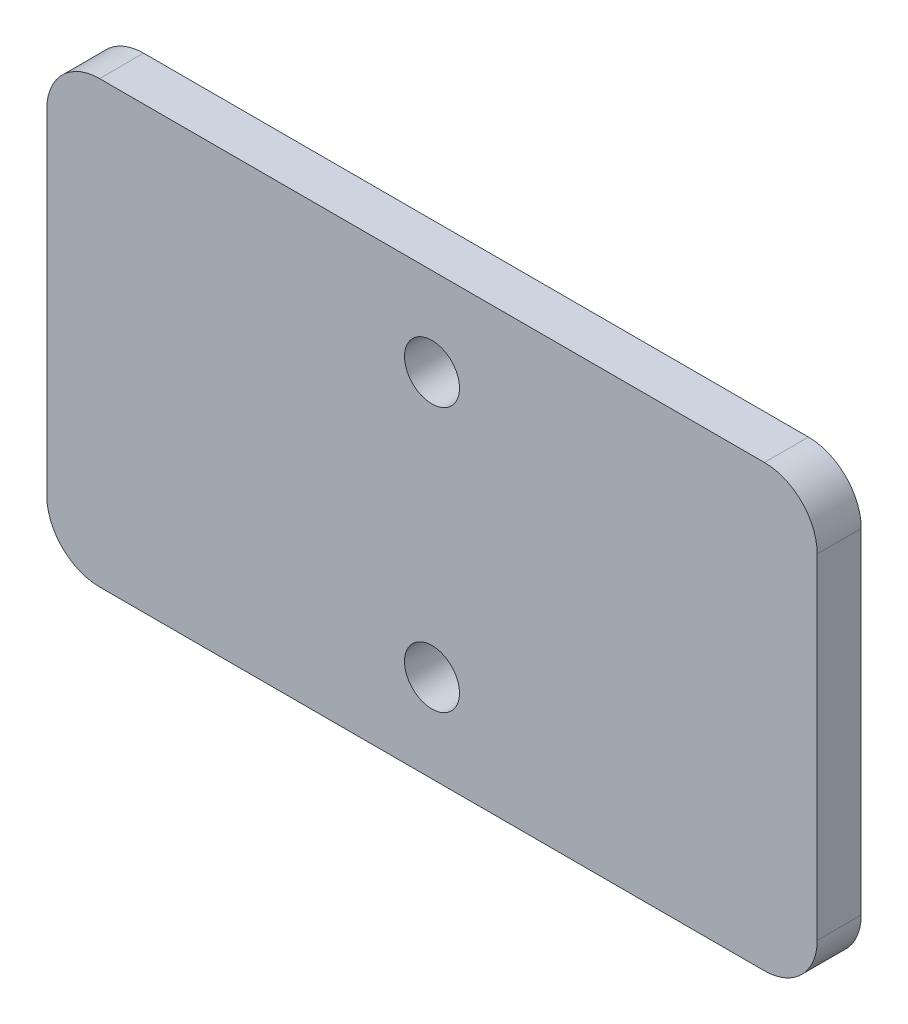
ISO-10303-21;
HEADER;
FILE_DESCRIPTION(('STEP AP214'),'2;1');
FILE_NAME('part.step','',(''),(''),'','','');
FILE_SCHEMA(('AUTOMOTIVE_DESIGN { 1 0 10303 214 1 1 1 1 }'));
ENDSEC;
DATA;
#1=APPLICATION_CONTEXT('core data for automotive mechanical design processes');
#2=APPLICATION_PROTOCOL_DEFINITION('international standard','automotive_design',2000,#1);
#3=PRODUCT_CONTEXT('',#1,'mechanical');
#4=PRODUCT('Part','Part','',(#3));
#5=PRODUCT_RELATED_PRODUCT_CATEGORY('part','',(#4));
#6=PRODUCT_DEFINITION_FORMATION('','',#4);
#7=PRODUCT_DEFINITION_CONTEXT('part definition',#1,'design');
#8=PRODUCT_DEFINITION('design','',#6,#7);
#9=PRODUCT_DEFINITION_SHAPE('','',#8);
#10=(LENGTH_UNIT() NAMED_UNIT(*) SI_UNIT(.MILLI.,.METRE.));
#11=(NAMED_UNIT(*) PLANE_ANGLE_UNIT() SI_UNIT($,.RADIAN.));
#12=(NAMED_UNIT(*) SI_UNIT($,.STERADIAN.) SOLID_ANGLE_UNIT());
#13=UNCERTAINTY_MEASURE_WITH_UNIT(LENGTH_MEASURE(1.E-05),#10,'distance_accuracy_value','');
#14=(GEOMETRIC_REPRESENTATION_CONTEXT(3) GLOBAL_UNCERTAINTY_ASSIGNED_CONTEXT((#13)) GLOBAL_UNIT_ASSIGNED_CONTEXT((#10,
#11,#12)) REPRESENTATION_CONTEXT('',''));
#15=CARTESIAN_POINT('',(0.,0.,0.));
#16=DIRECTION('',(0.,0.,1.));
#17=DIRECTION('',(1.,0.,0.));
#18=AXIS2_PLACEMENT_3D('',#15,#16,#17);
#19=CARTESIAN_POINT('',(0.,0.,10.));
#20=DIRECTION('',(0.,0.,1.));
#21=DIRECTION('',(1.,0.,0.));
#22=AXIS2_PLACEMENT_3D('',#19,#20,#21);
#23=PLANE('',#22);
#24=CARTESIAN_POINT('',(0.,30.,10.));
#25=DIRECTION('',(0.,0.,1.));
#26=DIRECTION('',(1.,0.,0.));
#27=AXIS2_PLACEMENT_3D('',#24,#25,#26);
#28=CIRCLE('',#27,6.25);
#29=CARTESIAN_POINT('',(6.25,30.,10.));
#30=VERTEX_POINT('',#29);
#31=EDGE_CURVE('E178',#30,#30,#28,.T.);
#32=ORIENTED_EDGE('',*,*,#31,.F.);
#33=EDGE_LOOP('',(#32));
#34=FACE_BOUND('',#33,.T.);
#35=DIRECTION('',(-1.,0.,0.));
#36=VECTOR('',#35,1.);
#37=CARTESIAN_POINT('',(-87.5,50.,10.));
#38=LINE('',#37,#36);
#39=CARTESIAN_POINT('',(75.5,50.,10.));
#40=VERTEX_POINT('',#39);
#41=CARTESIAN_POINT('',(-75.5,50.,10.));
#42=VERTEX_POINT('',#41);
#43=EDGE_CURVE('E169',#40,#42,#38,.T.);
#44=ORIENTED_EDGE('',*,*,#43,.T.);
#45=CARTESIAN_POINT('',(-75.5,38.,10.));
#46=DIRECTION('',(0.,0.,1.));
#47=DIRECTION('',(1.,0.,0.));
#48=AXIS2_PLACEMENT_3D('',#45,#46,#47);
#49=CIRCLE('',#48,12.);
#50=CARTESIAN_POINT('',(-87.5,38.,10.));
#51=VERTEX_POINT('',#50);
#52=EDGE_CURVE('E147',#42,#51,#49,.T.);
#53=ORIENTED_EDGE('',*,*,#52,.T.);
#54=DIRECTION('',(0.,-1.,0.));
#55=VECTOR('',#54,1.);
#56=CARTESIAN_POINT('',(-87.5,50.,10.));
#57=LINE('',#56,#55);
#58=CARTESIAN_POINT('',(-87.5,-38.,10.));
#59=VERTEX_POINT('',#58);
#60=EDGE_CURVE('E117',#51,#59,#57,.T.);
#61=ORIENTED_EDGE('',*,*,#60,.T.);
#62=CARTESIAN_POINT('',(-75.5,-38.,10.));
#63=DIRECTION('',(0.,0.,1.));
#64=DIRECTION('',(1.,0.,0.));
#65=AXIS2_PLACEMENT_3D('',#62,#63,#64);
#66=CIRCLE('',#65,12.);
#67=CARTESIAN_POINT('',(-75.5,-50.,10.));
#68=VERTEX_POINT('',#67);
#69=EDGE_CURVE('E53',#59,#68,#66,.T.);
#70=ORIENTED_EDGE('',*,*,#69,.T.);
#71=DIRECTION('',(1.,0.,0.));
#72=VECTOR('',#71,1.);
#73=CARTESIAN_POINT('',(-87.5,-50.,10.));
#74=LINE('',#73,#72);
#75=CARTESIAN_POINT('',(75.5,-50.,10.));
#76=VERTEX_POINT('',#75);
#77=EDGE_CURVE('E133',#68,#76,#74,.T.);
#78=ORIENTED_EDGE('',*,*,#77,.T.);
#79=CARTESIAN_POINT('',(75.5,-38.,10.));
#80=DIRECTION('',(0.,0.,1.));
#81=DIRECTION('',(1.,0.,0.));
#82=AXIS2_PLACEMENT_3D('',#79,#80,#81);
#83=CIRCLE('',#82,12.);
#84=CARTESIAN_POINT('',(87.5,-38.,10.));
#85=VERTEX_POINT('',#84);
#86=EDGE_CURVE('E143',#76,#85,#83,.T.);
#87=ORIENTED_EDGE('',*,*,#86,.T.);
#88=DIRECTION('',(0.,1.,0.));
#89=VECTOR('',#88,1.);
#90=CARTESIAN_POINT('',(87.5,50.,10.));
#91=LINE('',#90,#89);
#92=CARTESIAN_POINT('',(87.5,38.,10.));
#93=VERTEX_POINT('',#92);
#94=EDGE_CURVE('E127',#85,#93,#91,.T.);
#95=ORIENTED_EDGE('',*,*,#94,.T.);
#96=CARTESIAN_POINT('',(75.5,38.,10.));
#97=DIRECTION('',(0.,0.,1.));
#98=DIRECTION('',(1.,0.,0.));
#99=AXIS2_PLACEMENT_3D('',#96,#97,#98);
#100=CIRCLE('',#99,12.);
#101=EDGE_CURVE('E145',#93,#40,#100,.T.);
#102=ORIENTED_EDGE('',*,*,#101,.T.);
#103=EDGE_LOOP('',(#44,#53,#61,#70,#78,#87,#95,#102));
#104=FACE_BOUND('',#103,.T.);
#105=CARTESIAN_POINT('',(0.,-30.,10.));
#106=DIRECTION('',(0.,0.,1.));
#107=DIRECTION('',(1.,0.,0.));
#108=AXIS2_PLACEMENT_3D('',#105,#106,#107);
#109=CIRCLE('',#108,6.25);
#110=CARTESIAN_POINT('',(6.25,-30.,10.));
#111=VERTEX_POINT('',#110);
#112=EDGE_CURVE('E183',#111,#111,#109,.T.);
#113=ORIENTED_EDGE('',*,*,#112,.F.);
#114=EDGE_LOOP('',(#113));
#115=FACE_BOUND('',#114,.T.);
#116=ADVANCED_FACE('F33',(#34,#104,#115),#23,.T.);
#117=CARTESIAN_POINT('',(0.,0.,0.));
#118=DIRECTION('',(0.,0.,1.));
#119=DIRECTION('',(1.,0.,0.));
#120=AXIS2_PLACEMENT_3D('',#117,#118,#119);
#121=PLANE('',#120);
#122=DIRECTION('',(0.,-1.,0.));
#123=VECTOR('',#122,1.);
#124=CARTESIAN_POINT('',(-87.5,50.,0.));
#125=LINE('',#124,#123);
#126=CARTESIAN_POINT('',(-87.5,38.,0.));
#127=VERTEX_POINT('',#126);
#128=CARTESIAN_POINT('',(-87.5,-38.,0.));
#129=VERTEX_POINT('',#128);
#130=EDGE_CURVE('E115',#127,#129,#125,.T.);
#131=ORIENTED_EDGE('',*,*,#130,.F.);
#132=CARTESIAN_POINT('',(-75.5,38.,0.));
#133=DIRECTION('',(0.,0.,1.));
#134=DIRECTION('',(1.,0.,0.));
#135=AXIS2_PLACEMENT_3D('',#132,#133,#134);
#136=CIRCLE('',#135,12.);
#137=CARTESIAN_POINT('',(-75.5,50.,0.));
#138=VERTEX_POINT('',#137);
#139=EDGE_CURVE('E98',#127,#138,#136,.F.);
#140=ORIENTED_EDGE('',*,*,#139,.T.);
#141=DIRECTION('',(-1.,0.,0.));
#142=VECTOR('',#141,1.);
#143=CARTESIAN_POINT('',(-87.5,50.,0.));
#144=LINE('',#143,#142);
#145=CARTESIAN_POINT('',(75.5,50.,0.));
#146=VERTEX_POINT('',#145);
#147=EDGE_CURVE('E125',#146,#138,#144,.T.);
#148=ORIENTED_EDGE('',*,*,#147,.F.);
#149=CARTESIAN_POINT('',(75.5,38.,0.));
#150=DIRECTION('',(0.,0.,1.));
#151=DIRECTION('',(1.,0.,0.));
#152=AXIS2_PLACEMENT_3D('',#149,#150,#151);
#153=CIRCLE('',#152,12.);
#154=CARTESIAN_POINT('',(87.5,38.,0.));
#155=VERTEX_POINT('',#154);
#156=EDGE_CURVE('E109',#146,#155,#153,.F.);
#157=ORIENTED_EDGE('',*,*,#156,.T.);
#158=DIRECTION('',(0.,1.,0.));
#159=VECTOR('',#158,1.);
#160=CARTESIAN_POINT('',(87.5,50.,0.));
#161=LINE('',#160,#159);
#162=CARTESIAN_POINT('',(87.5,-38.,0.));
#163=VERTEX_POINT('',#162);
#164=EDGE_CURVE('E129',#163,#155,#161,.T.);
#165=ORIENTED_EDGE('',*,*,#164,.F.);
#166=CARTESIAN_POINT('',(75.5,-38.,0.));
#167=DIRECTION('',(0.,0.,1.));
#168=DIRECTION('',(1.,0.,0.));
#169=AXIS2_PLACEMENT_3D('',#166,#167,#168);
#170=CIRCLE('',#169,12.);
#171=CARTESIAN_POINT('',(75.5,-50.,0.));
#172=VERTEX_POINT('',#171);
#173=EDGE_CURVE('E136',#163,#172,#170,.F.);
#174=ORIENTED_EDGE('',*,*,#173,.T.);
#175=DIRECTION('',(1.,0.,0.));
#176=VECTOR('',#175,1.);
#177=CARTESIAN_POINT('',(-87.5,-50.,0.));
#178=LINE('',#177,#176);
#179=CARTESIAN_POINT('',(-75.5,-50.,0.));
#180=VERTEX_POINT('',#179);
#181=EDGE_CURVE('E124',#180,#172,#178,.T.);
#182=ORIENTED_EDGE('',*,*,#181,.F.);
#183=CARTESIAN_POINT('',(-75.5,-38.,0.));
#184=DIRECTION('',(0.,0.,1.));
#185=DIRECTION('',(1.,0.,0.));
#186=AXIS2_PLACEMENT_3D('',#183,#184,#185);
#187=CIRCLE('',#186,12.);
#188=EDGE_CURVE('E118',#180,#129,#187,.F.);
#189=ORIENTED_EDGE('',*,*,#188,.T.);
#190=EDGE_LOOP('',(#131,#140,#148,#157,#165,#174,#182,#189));
#191=FACE_BOUND('',#190,.T.);
#192=CARTESIAN_POINT('',(0.,30.,0.));
#193=DIRECTION('',(0.,0.,1.));
#194=DIRECTION('',(1.,0.,0.));
#195=AXIS2_PLACEMENT_3D('',#192,#193,#194);
#196=CIRCLE('',#195,6.25);
#197=CARTESIAN_POINT('',(6.25,30.,0.));
#198=VERTEX_POINT('',#197);
#199=EDGE_CURVE('E174',#198,#198,#196,.T.);
#200=ORIENTED_EDGE('',*,*,#199,.T.);
#201=EDGE_LOOP('',(#200));
#202=FACE_BOUND('',#201,.T.);
#203=CARTESIAN_POINT('',(0.,-30.,0.));
#204=DIRECTION('',(0.,0.,1.));
#205=DIRECTION('',(1.,0.,0.));
#206=AXIS2_PLACEMENT_3D('',#203,#204,#205);
#207=CIRCLE('',#206,6.25);
#208=CARTESIAN_POINT('',(6.25,-30.,0.));
#209=VERTEX_POINT('',#208);
#210=EDGE_CURVE('E185',#209,#209,#207,.T.);
#211=ORIENTED_EDGE('',*,*,#210,.T.);
#212=EDGE_LOOP('',(#211));
#213=FACE_BOUND('',#212,.T.);
#214=ADVANCED_FACE('F121',(#191,#202,#213),#121,.F.);
#215=CARTESIAN_POINT('',(87.5,50.,10.));
#216=DIRECTION('',(-1.,0.,0.));
#217=DIRECTION('',(0.,0.,1.));
#218=AXIS2_PLACEMENT_3D('',#215,#216,#217);
#219=PLANE('',#218);
#220=ORIENTED_EDGE('',*,*,#164,.T.);
#221=DIRECTION('',(0.,0.,-1.));
#222=VECTOR('',#221,1.);
#223=CARTESIAN_POINT('',(87.5,38.,10.));
#224=LINE('',#223,#222);
#225=EDGE_CURVE('E152',#155,#93,#224,.F.);
#226=ORIENTED_EDGE('',*,*,#225,.T.);
#227=ORIENTED_EDGE('',*,*,#94,.F.);
#228=DIRECTION('',(0.,0.,-1.));
#229=VECTOR('',#228,1.);
#230=CARTESIAN_POINT('',(87.5,-38.,10.));
#231=LINE('',#230,#229);
#232=EDGE_CURVE('E149',#85,#163,#231,.T.);
#233=ORIENTED_EDGE('',*,*,#232,.T.);
#234=EDGE_LOOP('',(#220,#226,#227,#233));
#235=FACE_BOUND('',#234,.T.);
#236=ADVANCED_FACE('F165',(#235),#219,.F.);
#237=CARTESIAN_POINT('',(-87.5,50.,10.));
#238=DIRECTION('',(0.,-1.,0.));
#239=DIRECTION('',(0.,0.,-1.));
#240=AXIS2_PLACEMENT_3D('',#237,#238,#239);
#241=PLANE('',#240);
#242=ORIENTED_EDGE('',*,*,#147,.T.);
#243=DIRECTION('',(0.,0.,-1.));
#244=VECTOR('',#243,1.);
#245=CARTESIAN_POINT('',(-75.5,50.,10.));
#246=LINE('',#245,#244);
#247=EDGE_CURVE('E103',#138,#42,#246,.F.);
#248=ORIENTED_EDGE('',*,*,#247,.T.);
#249=ORIENTED_EDGE('',*,*,#43,.F.);
#250=DIRECTION('',(0.,0.,-1.));
#251=VECTOR('',#250,1.);
#252=CARTESIAN_POINT('',(75.5,50.,10.));
#253=LINE('',#252,#251);
#254=EDGE_CURVE('E108',#40,#146,#253,.T.);
#255=ORIENTED_EDGE('',*,*,#254,.T.);
#256=EDGE_LOOP('',(#242,#248,#249,#255));
#257=FACE_BOUND('',#256,.T.);
#258=ADVANCED_FACE('F209',(#257),#241,.F.);
#259=CARTESIAN_POINT('',(-87.5,50.,10.));
#260=DIRECTION('',(1.,0.,0.));
#261=DIRECTION('',(0.,0.,-1.));
#262=AXIS2_PLACEMENT_3D('',#259,#260,#261);
#263=PLANE('',#262);
#264=ORIENTED_EDGE('',*,*,#60,.F.);
#265=DIRECTION('',(0.,0.,-1.));
#266=VECTOR('',#265,1.);
#267=CARTESIAN_POINT('',(-87.5,38.,10.));
#268=LINE('',#267,#266);
#269=EDGE_CURVE('E102',#51,#127,#268,.T.);
#270=ORIENTED_EDGE('',*,*,#269,.T.);
#271=ORIENTED_EDGE('',*,*,#130,.T.);
#272=DIRECTION('',(0.,0.,-1.));
#273=VECTOR('',#272,1.);
#274=CARTESIAN_POINT('',(-87.5,-38.,10.));
#275=LINE('',#274,#273);
#276=EDGE_CURVE('E119',#129,#59,#275,.F.);
#277=ORIENTED_EDGE('',*,*,#276,.T.);
#278=EDGE_LOOP('',(#264,#270,#271,#277));
#279=FACE_BOUND('',#278,.T.);
#280=ADVANCED_FACE('F114',(#279),#263,.F.);
#281=CARTESIAN_POINT('',(-87.5,-50.,10.));
#282=DIRECTION('',(0.,1.,0.));
#283=DIRECTION('',(0.,0.,1.));
#284=AXIS2_PLACEMENT_3D('',#281,#282,#283);
#285=PLANE('',#284);
#286=ORIENTED_EDGE('',*,*,#181,.T.);
#287=DIRECTION('',(0.,0.,-1.));
#288=VECTOR('',#287,1.);
#289=CARTESIAN_POINT('',(75.5,-50.,10.));
#290=LINE('',#289,#288);
#291=EDGE_CURVE('E11',#172,#76,#290,.F.);
#292=ORIENTED_EDGE('',*,*,#291,.T.);
#293=ORIENTED_EDGE('',*,*,#77,.F.);
#294=DIRECTION('',(0.,0.,-1.));
#295=VECTOR('',#294,1.);
#296=CARTESIAN_POINT('',(-75.5,-50.,10.));
#297=LINE('',#296,#295);
#298=EDGE_CURVE('E41',#68,#180,#297,.T.);
#299=ORIENTED_EDGE('',*,*,#298,.T.);
#300=EDGE_LOOP('',(#286,#292,#293,#299));
#301=FACE_BOUND('',#300,.T.);
#302=ADVANCED_FACE('F155',(#301),#285,.F.);
#303=CARTESIAN_POINT('',(0.,30.,10.));
#304=DIRECTION('',(0.,0.,-1.));
#305=DIRECTION('',(-1.,0.,0.));
#306=AXIS2_PLACEMENT_3D('',#303,#304,#305);
#307=CYLINDRICAL_SURFACE('',#306,6.25);
#308=ORIENTED_EDGE('',*,*,#31,.T.);
#309=EDGE_LOOP('',(#308));
#310=FACE_BOUND('',#309,.T.);
#311=ORIENTED_EDGE('',*,*,#199,.F.);
#312=EDGE_LOOP('',(#311));
#313=FACE_BOUND('',#312,.T.);
#314=ADVANCED_FACE('F202',(#310,#313),#307,.F.);
#315=CARTESIAN_POINT('',(0.,-30.,10.));
#316=DIRECTION('',(0.,0.,-1.));
#317=DIRECTION('',(-1.,0.,0.));
#318=AXIS2_PLACEMENT_3D('',#315,#316,#317);
#319=CYLINDRICAL_SURFACE('',#318,6.25);
#320=ORIENTED_EDGE('',*,*,#112,.T.);
#321=EDGE_LOOP('',(#320));
#322=FACE_BOUND('',#321,.T.);
#323=ORIENTED_EDGE('',*,*,#210,.F.);
#324=EDGE_LOOP('',(#323));
#325=FACE_BOUND('',#324,.T.);
#326=ADVANCED_FACE('F191',(#322,#325),#319,.F.);
#327=CARTESIAN_POINT('',(-75.5,38.,10.));
#328=DIRECTION('',(0.,0.,-1.));
#329=DIRECTION('',(-1.,0.,0.));
#330=AXIS2_PLACEMENT_3D('',#327,#328,#329);
#331=CYLINDRICAL_SURFACE('',#330,12.);
#332=ORIENTED_EDGE('',*,*,#52,.F.);
#333=ORIENTED_EDGE('',*,*,#247,.F.);
#334=ORIENTED_EDGE('',*,*,#139,.F.);
#335=ORIENTED_EDGE('',*,*,#269,.F.);
#336=EDGE_LOOP('',(#332,#333,#334,#335));
#337=FACE_BOUND('',#336,.T.);
#338=ADVANCED_FACE('F101',(#337),#331,.T.);
#339=CARTESIAN_POINT('',(75.5,38.,10.));
#340=DIRECTION('',(0.,0.,-1.));
#341=DIRECTION('',(-1.,0.,0.));
#342=AXIS2_PLACEMENT_3D('',#339,#340,#341);
#343=CYLINDRICAL_SURFACE('',#342,12.);
#344=ORIENTED_EDGE('',*,*,#101,.F.);
#345=ORIENTED_EDGE('',*,*,#225,.F.);
#346=ORIENTED_EDGE('',*,*,#156,.F.);
#347=ORIENTED_EDGE('',*,*,#254,.F.);
#348=EDGE_LOOP('',(#344,#345,#346,#347));
#349=FACE_BOUND('',#348,.T.);
#350=ADVANCED_FACE('F217',(#349),#343,.T.);
#351=CARTESIAN_POINT('',(75.5,-38.,10.));
#352=DIRECTION('',(0.,0.,-1.));
#353=DIRECTION('',(-1.,0.,0.));
#354=AXIS2_PLACEMENT_3D('',#351,#352,#353);
#355=CYLINDRICAL_SURFACE('',#354,12.);
#356=ORIENTED_EDGE('',*,*,#86,.F.);
#357=ORIENTED_EDGE('',*,*,#291,.F.);
#358=ORIENTED_EDGE('',*,*,#173,.F.);
#359=ORIENTED_EDGE('',*,*,#232,.F.);
#360=EDGE_LOOP('',(#356,#357,#358,#359));
#361=FACE_BOUND('',#360,.T.);
#362=ADVANCED_FACE('F162',(#361),#355,.T.);
#363=CARTESIAN_POINT('',(-75.5,-38.,10.));
#364=DIRECTION('',(0.,0.,-1.));
#365=DIRECTION('',(-1.,0.,0.));
#366=AXIS2_PLACEMENT_3D('',#363,#364,#365);
#367=CYLINDRICAL_SURFACE('',#366,12.);
#368=ORIENTED_EDGE('',*,*,#69,.F.);
#369=ORIENTED_EDGE('',*,*,#276,.F.);
#370=ORIENTED_EDGE('',*,*,#188,.F.);
#371=ORIENTED_EDGE('',*,*,#298,.F.);
#372=EDGE_LOOP('',(#368,#369,#370,#371));
#373=FACE_BOUND('',#372,.T.);
#374=ADVANCED_FACE('F35',(#373),#367,.T.);
#375=CLOSED_SHELL('',(#116,#214,#236,#258,#280,#302,#314,#326,#338,#350,#362,#374));
#376=MANIFOLD_SOLID_BREP('B2',#375);
#377=ADVANCED_BREP_SHAPE_REPRESENTATION('',(#18,#376),#14);
#378=SHAPE_DEFINITION_REPRESENTATION(#9,#377);
ENDSEC;
END-ISO-10303-21;
